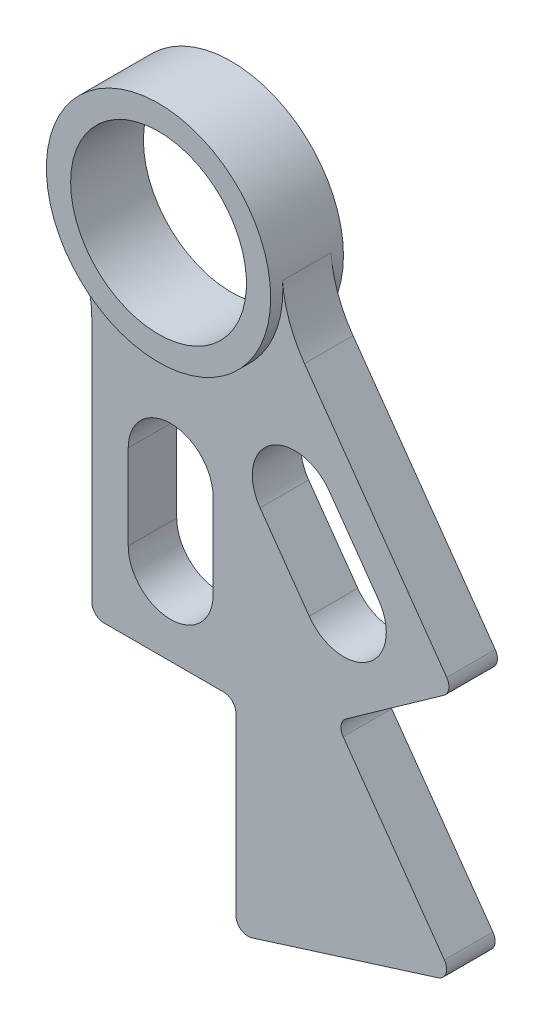
ISO-10303-21;
HEADER;
FILE_DESCRIPTION(('STEP AP214'),'2;1');
FILE_NAME('part.step','',(''),(''),'','','');
FILE_SCHEMA(('AUTOMOTIVE_DESIGN { 1 0 10303 214 1 1 1 1 }'));
ENDSEC;
DATA;
#1=APPLICATION_CONTEXT('core data for automotive mechanical design processes');
#2=APPLICATION_PROTOCOL_DEFINITION('international standard','automotive_design',2000,#1);
#3=PRODUCT_CONTEXT('',#1,'mechanical');
#4=PRODUCT('Part','Part','',(#3));
#5=PRODUCT_RELATED_PRODUCT_CATEGORY('part','',(#4));
#6=PRODUCT_DEFINITION_FORMATION('','',#4);
#7=PRODUCT_DEFINITION_CONTEXT('part definition',#1,'design');
#8=PRODUCT_DEFINITION('design','',#6,#7);
#9=PRODUCT_DEFINITION_SHAPE('','',#8);
#10=(LENGTH_UNIT() NAMED_UNIT(*) SI_UNIT(.MILLI.,.METRE.));
#11=(NAMED_UNIT(*) PLANE_ANGLE_UNIT() SI_UNIT($,.RADIAN.));
#12=(NAMED_UNIT(*) SI_UNIT($,.STERADIAN.) SOLID_ANGLE_UNIT());
#13=UNCERTAINTY_MEASURE_WITH_UNIT(LENGTH_MEASURE(1.E-05),#10,'distance_accuracy_value','');
#14=(GEOMETRIC_REPRESENTATION_CONTEXT(3) GLOBAL_UNCERTAINTY_ASSIGNED_CONTEXT((#13)) GLOBAL_UNIT_ASSIGNED_CONTEXT((#10,
#11,#12)) REPRESENTATION_CONTEXT('',''));
#15=CARTESIAN_POINT('',(0.,0.,0.));
#16=DIRECTION('',(0.,0.,1.));
#17=DIRECTION('',(1.,0.,0.));
#18=AXIS2_PLACEMENT_3D('',#15,#16,#17);
#19=CARTESIAN_POINT('',(0.,0.,4.7625));
#20=DIRECTION('',(0.,0.,-1.));
#21=DIRECTION('',(-1.,0.,0.));
#22=AXIS2_PLACEMENT_3D('',#19,#20,#21);
#23=CYLINDRICAL_SURFACE('',#22,11.5062);
#24=CARTESIAN_POINT('',(0.,0.,4.7625));
#25=DIRECTION('',(0.,0.,1.));
#26=DIRECTION('',(1.,0.,0.));
#27=AXIS2_PLACEMENT_3D('',#24,#25,#26);
#28=CIRCLE('',#27,11.5062);
#29=CARTESIAN_POINT('',(-11.5062,0.,4.7625));
#30=VERTEX_POINT('',#29);
#31=EDGE_CURVE('E396',#30,#30,#28,.T.);
#32=CARTESIAN_POINT('',(0.,0.,-4.7625));
#33=DIRECTION('',(0.,0.,1.));
#34=DIRECTION('',(1.,0.,0.));
#35=AXIS2_PLACEMENT_3D('',#32,#33,#34);
#36=CIRCLE('',#35,11.5062);
#37=CARTESIAN_POINT('',(-11.5062,0.,-4.7625));
#38=VERTEX_POINT('',#37);
#39=EDGE_CURVE('E377',#38,#38,#36,.T.);
#40=CARTESIAN_POINT('',(-11.5062,0.,4.7625));
#41=CARTESIAN_POINT('',(-11.5062,0.,4.66328125));
#42=CARTESIAN_POINT('',(-11.5062,0.,4.5640625));
#43=CARTESIAN_POINT('',(-11.5062,0.,4.365625));
#44=CARTESIAN_POINT('',(-11.5062,0.,4.26640625));
#45=CARTESIAN_POINT('',(-11.5062,0.,4.06796875));
#46=CARTESIAN_POINT('',(-11.5062,0.,3.96875));
#47=CARTESIAN_POINT('',(-11.5062,0.,3.7703125));
#48=CARTESIAN_POINT('',(-11.5062,0.,3.67109375));
#49=CARTESIAN_POINT('',(-11.5062,0.,3.47265625));
#50=CARTESIAN_POINT('',(-11.5062,0.,3.3734375));
#51=CARTESIAN_POINT('',(-11.5062,0.,3.175));
#52=CARTESIAN_POINT('',(-11.5062,0.,3.07578125));
#53=CARTESIAN_POINT('',(-11.5062,0.,2.87734375));
#54=CARTESIAN_POINT('',(-11.5062,0.,2.778125));
#55=CARTESIAN_POINT('',(-11.5062,0.,2.5796875));
#56=CARTESIAN_POINT('',(-11.5062,0.,2.48046875));
#57=CARTESIAN_POINT('',(-11.5062,0.,2.28203125));
#58=CARTESIAN_POINT('',(-11.5062,0.,2.1828125));
#59=CARTESIAN_POINT('',(-11.5062,0.,1.984375));
#60=CARTESIAN_POINT('',(-11.5062,0.,1.88515625));
#61=CARTESIAN_POINT('',(-11.5062,0.,1.68671875));
#62=CARTESIAN_POINT('',(-11.5062,0.,1.5875));
#63=CARTESIAN_POINT('',(-11.5062,0.,1.3890625));
#64=CARTESIAN_POINT('',(-11.5062,0.,1.28984375));
#65=CARTESIAN_POINT('',(-11.5062,0.,1.09140625));
#66=CARTESIAN_POINT('',(-11.5062,0.,0.992187499999999));
#67=CARTESIAN_POINT('',(-11.5062,0.,0.79375));
#68=CARTESIAN_POINT('',(-11.5062,0.,0.69453125));
#69=CARTESIAN_POINT('',(-11.5062,0.,0.49609375));
#70=CARTESIAN_POINT('',(-11.5062,0.,0.396875));
#71=CARTESIAN_POINT('',(-11.5062,0.,0.1984375));
#72=CARTESIAN_POINT('',(-11.5062,0.,0.0992187500000001));
#73=CARTESIAN_POINT('',(-11.5062,0.,-0.0992187500000001));
#74=CARTESIAN_POINT('',(-11.5062,0.,-0.1984375));
#75=CARTESIAN_POINT('',(-11.5062,0.,-0.396875));
#76=CARTESIAN_POINT('',(-11.5062,0.,-0.49609375));
#77=CARTESIAN_POINT('',(-11.5062,0.,-0.69453125));
#78=CARTESIAN_POINT('',(-11.5062,0.,-0.793750000000001));
#79=CARTESIAN_POINT('',(-11.5062,0.,-0.992187500000001));
#80=CARTESIAN_POINT('',(-11.5062,0.,-1.09140625));
#81=CARTESIAN_POINT('',(-11.5062,0.,-1.28984375));
#82=CARTESIAN_POINT('',(-11.5062,0.,-1.3890625));
#83=CARTESIAN_POINT('',(-11.5062,0.,-1.5875));
#84=CARTESIAN_POINT('',(-11.5062,0.,-1.68671875));
#85=CARTESIAN_POINT('',(-11.5062,0.,-1.88515625));
#86=CARTESIAN_POINT('',(-11.5062,0.,-1.984375));
#87=CARTESIAN_POINT('',(-11.5062,0.,-2.1828125));
#88=CARTESIAN_POINT('',(-11.5062,0.,-2.28203125));
#89=CARTESIAN_POINT('',(-11.5062,0.,-2.48046875));
#90=CARTESIAN_POINT('',(-11.5062,0.,-2.5796875));
#91=CARTESIAN_POINT('',(-11.5062,0.,-2.778125));
#92=CARTESIAN_POINT('',(-11.5062,0.,-2.87734375));
#93=CARTESIAN_POINT('',(-11.5062,0.,-3.07578125));
#94=CARTESIAN_POINT('',(-11.5062,0.,-3.175));
#95=CARTESIAN_POINT('',(-11.5062,0.,-3.3734375));
#96=CARTESIAN_POINT('',(-11.5062,0.,-3.47265625));
#97=CARTESIAN_POINT('',(-11.5062,0.,-3.67109375));
#98=CARTESIAN_POINT('',(-11.5062,0.,-3.7703125));
#99=CARTESIAN_POINT('',(-11.5062,0.,-3.96875));
#100=CARTESIAN_POINT('',(-11.5062,0.,-4.06796875));
#101=CARTESIAN_POINT('',(-11.5062,0.,-4.26640625));
#102=CARTESIAN_POINT('',(-11.5062,0.,-4.365625));
#103=CARTESIAN_POINT('',(-11.5062,0.,-4.5640625));
#104=CARTESIAN_POINT('',(-11.5062,0.,-4.66328125));
#105=CARTESIAN_POINT('',(-11.5062,0.,-4.7625));
#106=B_SPLINE_CURVE_WITH_KNOTS('',3,(#40,#41,#42,#43,#44,#45,#46,#47,#48,#49,#50,#51,#52,#53,
#54,#55,#56,#57,#58,#59,#60,#61,#62,#63,#64,#65,#66,#67,#68,#69,#70,#71,#72,#73,#74,#75,#76,#77,
#78,#79,#80,#81,#82,#83,#84,#85,#86,#87,#88,#89,#90,#91,#92,#93,#94,#95,#96,#97,#98,#99,#100,
#101,#102,#103,#104,#105),.UNSPECIFIED.,.F.,.F.,(4,2,2,2,2,2,2,2,2,2,2,2,2,2,2,2,2,2,2,2,2,2,2,
2,2,2,2,2,2,2,2,2,4),(0.,0.29765625,0.5953125,0.892968750000001,1.190625,1.48828125,1.7859375,
2.08359375,2.38125,2.67890625,2.9765625,3.27421875,3.571875,3.86953125,4.1671875,4.46484375,
4.7625,5.06015625,5.3578125,5.65546875,5.953125,6.25078125,6.5484375,6.84609375,7.14375,
7.44140625,7.7390625,8.03671875,8.334375,8.63203125,8.9296875,9.22734375,9.525),.UNSPECIFIED.);
#107=EDGE_CURVE('BSEAM47',#30,#38,#106,.T.);
#108=ORIENTED_EDGE('',*,*,#31,.T.);
#109=ORIENTED_EDGE('',*,*,#39,.F.);
#110=ORIENTED_EDGE('',*,*,#107,.T.);
#111=ORIENTED_EDGE('',*,*,#107,.F.);
#112=EDGE_LOOP('',(#108,#110,#109,#111));
#113=FACE_BOUND('',#112,.T.);
#114=ADVANCED_FACE('F47',(#113),#23,.F.);
#115=CARTESIAN_POINT('',(0.,0.,4.7625));
#116=DIRECTION('',(0.,0.,-1.));
#117=DIRECTION('',(-1.,0.,0.));
#118=AXIS2_PLACEMENT_3D('',#115,#116,#117);
#119=CYLINDRICAL_SURFACE('',#118,14.6812);
#120=DIRECTION('',(0.,0.,-1.));
#121=VECTOR('',#120,1.);
#122=CARTESIAN_POINT('',(-12.585193266832,-7.55979787272687,3.175));
#123=LINE('',#122,#121);
#124=CARTESIAN_POINT('',(-12.585193266832,-7.55979787272688,3.175));
#125=VERTEX_POINT('',#124);
#126=CARTESIAN_POINT('',(-12.585193266832,-7.55979787272687,-3.175));
#127=VERTEX_POINT('',#126);
#128=EDGE_CURVE('E390',#125,#127,#123,.T.);
#129=ORIENTED_EDGE('',*,*,#128,.F.);
#130=CARTESIAN_POINT('',(0.,0.,3.175));
#131=DIRECTION('',(0.,0.,1.));
#132=DIRECTION('',(1.,0.,0.));
#133=AXIS2_PLACEMENT_3D('',#130,#131,#132);
#134=CIRCLE('',#133,14.6812);
#135=CARTESIAN_POINT('',(14.6391568085927,1.11027986266355,3.175));
#136=VERTEX_POINT('',#135);
#137=EDGE_CURVE('E240',#125,#136,#134,.T.);
#138=ORIENTED_EDGE('',*,*,#137,.T.);
#139=DIRECTION('',(0.,0.,-1.));
#140=VECTOR('',#139,1.);
#141=CARTESIAN_POINT('',(14.6391568085926,1.11027986266355,3.175));
#142=LINE('',#141,#140);
#143=CARTESIAN_POINT('',(14.6391568085926,1.11027986266355,-3.175));
#144=VERTEX_POINT('',#143);
#145=EDGE_CURVE('E236',#136,#144,#142,.T.);
#146=ORIENTED_EDGE('',*,*,#145,.T.);
#147=CARTESIAN_POINT('',(0.,0.,-3.175));
#148=DIRECTION('',(0.,0.,1.));
#149=DIRECTION('',(1.,0.,0.));
#150=AXIS2_PLACEMENT_3D('',#147,#148,#149);
#151=CIRCLE('',#150,14.6812);
#152=EDGE_CURVE('E308',#127,#144,#151,.T.);
#153=ORIENTED_EDGE('',*,*,#152,.F.);
#154=EDGE_LOOP('',(#129,#138,#146,#153));
#155=FACE_BOUND('',#154,.T.);
#156=CARTESIAN_POINT('',(0.,0.,4.7625));
#157=DIRECTION('',(0.,0.,1.));
#158=DIRECTION('',(1.,0.,0.));
#159=AXIS2_PLACEMENT_3D('',#156,#157,#158);
#160=CIRCLE('',#159,14.6812);
#161=CARTESIAN_POINT('',(14.6812,0.,4.7625));
#162=VERTEX_POINT('',#161);
#163=EDGE_CURVE('E400',#162,#162,#160,.T.);
#164=ORIENTED_EDGE('',*,*,#163,.F.);
#165=EDGE_LOOP('',(#164));
#166=FACE_BOUND('',#165,.T.);
#167=CARTESIAN_POINT('',(0.,0.,-4.7625));
#168=DIRECTION('',(0.,0.,1.));
#169=DIRECTION('',(1.,0.,0.));
#170=AXIS2_PLACEMENT_3D('',#167,#168,#169);
#171=CIRCLE('',#170,14.6812);
#172=CARTESIAN_POINT('',(14.6812,0.,-4.7625));
#173=VERTEX_POINT('',#172);
#174=EDGE_CURVE('E401',#173,#173,#171,.T.);
#175=ORIENTED_EDGE('',*,*,#174,.T.);
#176=EDGE_LOOP('',(#175));
#177=FACE_BOUND('',#176,.T.);
#178=ADVANCED_FACE('F530',(#155,#166,#177),#119,.T.);
#179=CARTESIAN_POINT('',(0.,0.,4.7625));
#180=DIRECTION('',(0.,0.,1.));
#181=DIRECTION('',(1.,0.,0.));
#182=AXIS2_PLACEMENT_3D('',#179,#180,#181);
#183=PLANE('',#182);
#184=ORIENTED_EDGE('',*,*,#31,.F.);
#185=EDGE_LOOP('',(#184));
#186=FACE_BOUND('',#185,.T.);
#187=ORIENTED_EDGE('',*,*,#163,.T.);
#188=EDGE_LOOP('',(#187));
#189=FACE_BOUND('',#188,.T.);
#190=ADVANCED_FACE('F555',(#186,#189),#183,.T.);
#191=CARTESIAN_POINT('',(0.,0.,-4.7625));
#192=DIRECTION('',(0.,0.,1.));
#193=DIRECTION('',(1.,0.,0.));
#194=AXIS2_PLACEMENT_3D('',#191,#192,#193);
#195=PLANE('',#194);
#196=ORIENTED_EDGE('',*,*,#39,.T.);
#197=EDGE_LOOP('',(#196));
#198=FACE_BOUND('',#197,.T.);
#199=ORIENTED_EDGE('',*,*,#174,.F.);
#200=EDGE_LOOP('',(#199));
#201=FACE_BOUND('',#200,.T.);
#202=ADVANCED_FACE('F764',(#198,#201),#195,.F.);
#203=CARTESIAN_POINT('',(0.,-27.9580697939256,3.175));
#204=DIRECTION('',(0.,0.,-1.));
#205=DIRECTION('',(-1.,0.,0.));
#206=AXIS2_PLACEMENT_3D('',#203,#204,#205);
#207=CYLINDRICAL_SURFACE('',#206,5.55624999999839);
#208=CARTESIAN_POINT('',(0.,-27.9580697939256,-3.175));
#209=DIRECTION('',(0.,0.,1.));
#210=DIRECTION('',(1.,0.,0.));
#211=AXIS2_PLACEMENT_3D('',#208,#209,#210);
#212=CIRCLE('',#211,5.55624999999839);
#213=CARTESIAN_POINT('',(5.55624999999839,-27.9580697939257,-3.175));
#214=VERTEX_POINT('',#213);
#215=CARTESIAN_POINT('',(-5.55624999999839,-27.9580697939257,-3.175));
#216=VERTEX_POINT('',#215);
#217=EDGE_CURVE('E347',#214,#216,#212,.T.);
#218=ORIENTED_EDGE('',*,*,#217,.F.);
#219=DIRECTION('',(0.,0.,-1.));
#220=VECTOR('',#219,1.);
#221=CARTESIAN_POINT('',(5.55624999999839,-27.9580697939257,3.175));
#222=LINE('',#221,#220);
#223=CARTESIAN_POINT('',(5.55624999999839,-27.9580697939257,3.175));
#224=VERTEX_POINT('',#223);
#225=EDGE_CURVE('E374',#224,#214,#222,.T.);
#226=ORIENTED_EDGE('',*,*,#225,.F.);
#227=CARTESIAN_POINT('',(0.,-27.9580697939256,3.175));
#228=DIRECTION('',(0.,0.,1.));
#229=DIRECTION('',(1.,0.,0.));
#230=AXIS2_PLACEMENT_3D('',#227,#228,#229);
#231=CIRCLE('',#230,5.55624999999839);
#232=CARTESIAN_POINT('',(-5.55624999999839,-27.9580697939257,3.175));
#233=VERTEX_POINT('',#232);
#234=EDGE_CURVE('E279',#224,#233,#231,.T.);
#235=ORIENTED_EDGE('',*,*,#234,.T.);
#236=DIRECTION('',(0.,0.,-1.));
#237=VECTOR('',#236,1.);
#238=CARTESIAN_POINT('',(-5.55624999999839,-27.9580697939257,3.175));
#239=LINE('',#238,#237);
#240=EDGE_CURVE('E364',#233,#216,#239,.T.);
#241=ORIENTED_EDGE('',*,*,#240,.T.);
#242=EDGE_LOOP('',(#218,#226,#235,#241));
#243=FACE_BOUND('',#242,.T.);
#244=ADVANCED_FACE('F754',(#243),#207,.F.);
#245=CARTESIAN_POINT('',(5.5562499999984,0.,3.175));
#246=DIRECTION('',(-1.,0.,0.));
#247=DIRECTION('',(0.,-1.,0.));
#248=AXIS2_PLACEMENT_3D('',#245,#246,#247);
#249=PLANE('',#248);
#250=DIRECTION('',(0.,1.,0.));
#251=VECTOR('',#250,1.);
#252=CARTESIAN_POINT('',(5.5562499999984,0.,-3.175));
#253=LINE('',#252,#251);
#254=CARTESIAN_POINT('',(5.55624999999839,-39.0705697939289,-3.175));
#255=VERTEX_POINT('',#254);
#256=EDGE_CURVE('E351',#255,#214,#253,.T.);
#257=ORIENTED_EDGE('',*,*,#256,.F.);
#258=DIRECTION('',(0.,0.,-1.));
#259=VECTOR('',#258,1.);
#260=CARTESIAN_POINT('',(5.55624999999839,-39.0705697939289,3.175));
#261=LINE('',#260,#259);
#262=CARTESIAN_POINT('',(5.55624999999839,-39.0705697939289,3.175));
#263=VERTEX_POINT('',#262);
#264=EDGE_CURVE('E371',#263,#255,#261,.T.);
#265=ORIENTED_EDGE('',*,*,#264,.F.);
#266=DIRECTION('',(0.,1.,0.));
#267=VECTOR('',#266,1.);
#268=CARTESIAN_POINT('',(5.5562499999984,0.,3.175));
#269=LINE('',#268,#267);
#270=EDGE_CURVE('E283',#263,#224,#269,.T.);
#271=ORIENTED_EDGE('',*,*,#270,.T.);
#272=ORIENTED_EDGE('',*,*,#225,.T.);
#273=EDGE_LOOP('',(#257,#265,#271,#272));
#274=FACE_BOUND('',#273,.T.);
#275=ADVANCED_FACE('F744',(#274),#249,.T.);
#276=CARTESIAN_POINT('',(0.,-39.0705697939289,3.175));
#277=DIRECTION('',(0.,0.,-1.));
#278=DIRECTION('',(-1.,0.,0.));
#279=AXIS2_PLACEMENT_3D('',#276,#277,#278);
#280=CYLINDRICAL_SURFACE('',#279,5.55624999999839);
#281=CARTESIAN_POINT('',(0.,-39.0705697939289,-3.175));
#282=DIRECTION('',(0.,0.,1.));
#283=DIRECTION('',(1.,0.,0.));
#284=AXIS2_PLACEMENT_3D('',#281,#282,#283);
#285=CIRCLE('',#284,5.55624999999839);
#286=CARTESIAN_POINT('',(-5.55624999999839,-39.0705697939289,-3.175));
#287=VERTEX_POINT('',#286);
#288=EDGE_CURVE('E355',#287,#255,#285,.T.);
#289=ORIENTED_EDGE('',*,*,#288,.F.);
#290=DIRECTION('',(0.,0.,-1.));
#291=VECTOR('',#290,1.);
#292=CARTESIAN_POINT('',(-5.55624999999839,-39.0705697939289,3.175));
#293=LINE('',#292,#291);
#294=CARTESIAN_POINT('',(-5.55624999999839,-39.0705697939289,3.175));
#295=VERTEX_POINT('',#294);
#296=EDGE_CURVE('E367',#295,#287,#293,.T.);
#297=ORIENTED_EDGE('',*,*,#296,.F.);
#298=CARTESIAN_POINT('',(0.,-39.0705697939289,3.175));
#299=DIRECTION('',(0.,0.,1.));
#300=DIRECTION('',(1.,0.,0.));
#301=AXIS2_PLACEMENT_3D('',#298,#299,#300);
#302=CIRCLE('',#301,5.55624999999839);
#303=EDGE_CURVE('E287',#295,#263,#302,.T.);
#304=ORIENTED_EDGE('',*,*,#303,.T.);
#305=ORIENTED_EDGE('',*,*,#264,.T.);
#306=EDGE_LOOP('',(#289,#297,#304,#305));
#307=FACE_BOUND('',#306,.T.);
#308=ADVANCED_FACE('F734',(#307),#280,.F.);
#309=CARTESIAN_POINT('',(16.2411710413148,-22.9127804627989,3.175));
#310=DIRECTION('',(0.,0.,-1.));
#311=DIRECTION('',(-1.,0.,0.));
#312=AXIS2_PLACEMENT_3D('',#309,#310,#311);
#313=CYLINDRICAL_SURFACE('',#312,5.55624999999837);
#314=CARTESIAN_POINT('',(16.2411710413148,-22.9127804627989,-3.175));
#315=DIRECTION('',(0.,0.,1.));
#316=DIRECTION('',(1.,0.,0.));
#317=AXIS2_PLACEMENT_3D('',#314,#315,#316);
#318=CIRCLE('',#317,5.55624999999837);
#319=CARTESIAN_POINT('',(20.774153774864,-19.6996851327742,-3.175));
#320=VERTEX_POINT('',#319);
#321=CARTESIAN_POINT('',(11.7081883077655,-26.1258757928235,-3.175));
#322=VERTEX_POINT('',#321);
#323=EDGE_CURVE('E331',#320,#322,#318,.T.);
#324=ORIENTED_EDGE('',*,*,#323,.F.);
#325=DIRECTION('',(0.,0.,-1.));
#326=VECTOR('',#325,1.);
#327=CARTESIAN_POINT('',(20.774153774864,-19.6996851327742,3.175));
#328=LINE('',#327,#326);
#329=CARTESIAN_POINT('',(20.774153774864,-19.6996851327742,3.175));
#330=VERTEX_POINT('',#329);
#331=EDGE_CURVE('E368',#330,#320,#328,.T.);
#332=ORIENTED_EDGE('',*,*,#331,.F.);
#333=CARTESIAN_POINT('',(16.2411710413148,-22.9127804627989,3.175));
#334=DIRECTION('',(0.,0.,1.));
#335=DIRECTION('',(1.,0.,0.));
#336=AXIS2_PLACEMENT_3D('',#333,#334,#335);
#337=CIRCLE('',#336,5.55624999999837);
#338=CARTESIAN_POINT('',(11.7081883077655,-26.1258757928235,3.175));
#339=VERTEX_POINT('',#338);
#340=EDGE_CURVE('E264',#330,#339,#337,.T.);
#341=ORIENTED_EDGE('',*,*,#340,.T.);
#342=DIRECTION('',(0.,0.,-1.));
#343=VECTOR('',#342,1.);
#344=CARTESIAN_POINT('',(11.7081883077655,-26.1258757928235,3.175));
#345=LINE('',#344,#343);
#346=EDGE_CURVE('E235',#339,#322,#345,.T.);
#347=ORIENTED_EDGE('',*,*,#346,.T.);
#348=EDGE_LOOP('',(#324,#332,#341,#347));
#349=FACE_BOUND('',#348,.T.);
#350=ADVANCED_FACE('F724',(#349),#313,.F.);
#351=CARTESIAN_POINT('',(4.53298273354924,3.21309533002468,3.175));
#352=DIRECTION('',(-0.815834912675017,-0.578284873795387,0.));
#353=DIRECTION('',(0.578284873795387,-0.815834912675018,0.));
#354=AXIS2_PLACEMENT_3D('',#351,#352,#353);
#355=PLANE('',#354);
#356=DIRECTION('',(-0.578284873795387,0.815834912675018,0.));
#357=VECTOR('',#356,1.);
#358=CARTESIAN_POINT('',(4.53298273354924,3.21309533002468,-3.175));
#359=LINE('',#358,#357);
#360=CARTESIAN_POINT('',(27.2003444349171,-28.7656505998779,-3.175));
#361=VERTEX_POINT('',#360);
#362=EDGE_CURVE('E335',#361,#320,#359,.T.);
#363=ORIENTED_EDGE('',*,*,#362,.F.);
#364=DIRECTION('',(0.,0.,-1.));
#365=VECTOR('',#364,1.);
#366=CARTESIAN_POINT('',(27.2003444349171,-28.7656505998779,3.175));
#367=LINE('',#366,#365);
#368=CARTESIAN_POINT('',(27.2003444349171,-28.7656505998779,3.175));
#369=VERTEX_POINT('',#368);
#370=EDGE_CURVE('E383',#369,#361,#367,.T.);
#371=ORIENTED_EDGE('',*,*,#370,.F.);
#372=DIRECTION('',(-0.578284873795387,0.815834912675018,0.));
#373=VECTOR('',#372,1.);
#374=CARTESIAN_POINT('',(4.53298273354924,3.21309533002468,3.175));
#375=LINE('',#374,#373);
#376=EDGE_CURVE('E268',#369,#330,#375,.T.);
#377=ORIENTED_EDGE('',*,*,#376,.T.);
#378=ORIENTED_EDGE('',*,*,#331,.T.);
#379=EDGE_LOOP('',(#363,#371,#377,#378));
#380=FACE_BOUND('',#379,.T.);
#381=ADVANCED_FACE('F714',(#380),#355,.T.);
#382=CARTESIAN_POINT('',(22.6673617013679,-31.9787459299026,3.175));
#383=DIRECTION('',(0.,0.,-1.));
#384=DIRECTION('',(-1.,0.,0.));
#385=AXIS2_PLACEMENT_3D('',#382,#383,#384);
#386=CYLINDRICAL_SURFACE('',#385,5.55624999999837);
#387=CARTESIAN_POINT('',(22.6673617013679,-31.9787459299026,-3.175));
#388=DIRECTION('',(0.,0.,1.));
#389=DIRECTION('',(1.,0.,0.));
#390=AXIS2_PLACEMENT_3D('',#387,#388,#389);
#391=CIRCLE('',#390,5.55624999999837);
#392=CARTESIAN_POINT('',(18.1343789678186,-35.1918412599272,-3.175));
#393=VERTEX_POINT('',#392);
#394=EDGE_CURVE('E339',#393,#361,#391,.T.);
#395=ORIENTED_EDGE('',*,*,#394,.F.);
#396=DIRECTION('',(0.,0.,-1.));
#397=VECTOR('',#396,1.);
#398=CARTESIAN_POINT('',(18.1343789678186,-35.1918412599272,3.175));
#399=LINE('',#398,#397);
#400=CARTESIAN_POINT('',(18.1343789678186,-35.1918412599272,3.175));
#401=VERTEX_POINT('',#400);
#402=EDGE_CURVE('E380',#401,#393,#399,.T.);
#403=ORIENTED_EDGE('',*,*,#402,.F.);
#404=CARTESIAN_POINT('',(22.6673617013679,-31.9787459299026,3.175));
#405=DIRECTION('',(0.,0.,1.));
#406=DIRECTION('',(1.,0.,0.));
#407=AXIS2_PLACEMENT_3D('',#404,#405,#406);
#408=CIRCLE('',#407,5.55624999999837);
#409=EDGE_CURVE('E272',#401,#369,#408,.T.);
#410=ORIENTED_EDGE('',*,*,#409,.T.);
#411=ORIENTED_EDGE('',*,*,#370,.T.);
#412=EDGE_LOOP('',(#395,#403,#410,#411));
#413=FACE_BOUND('',#412,.T.);
#414=ADVANCED_FACE('F680',(#413),#386,.F.);
#415=CARTESIAN_POINT('',(-6.96784203042782,-4.938986535867,3.175));
#416=DIRECTION('',(-0.815834912675017,-0.578284873795387,0.));
#417=DIRECTION('',(0.578284873795387,-0.815834912675018,0.));
#418=AXIS2_PLACEMENT_3D('',#415,#416,#417);
#419=PLANE('',#418);
#420=DIRECTION('',(-0.578284873795387,0.815834912675018,0.));
#421=VECTOR('',#420,1.);
#422=CARTESIAN_POINT('',(-6.96784203042782,-4.938986535867,-3.175));
#423=LINE('',#422,#421);
#424=CARTESIAN_POINT('',(35.828390380426,-65.3152165115493,-3.175));
#425=VERTEX_POINT('',#424);
#426=CARTESIAN_POINT('',(22.5847239495654,-46.6312668948052,-3.175));
#427=VERTEX_POINT('',#426);
#428=EDGE_CURVE('E295',#425,#427,#423,.T.);
#429=ORIENTED_EDGE('',*,*,#428,.T.);
#430=DIRECTION('',(0.,0.,-1.));
#431=VECTOR('',#430,1.);
#432=CARTESIAN_POINT('',(22.5847239495654,-46.6312668948052,3.175));
#433=LINE('',#432,#431);
#434=CARTESIAN_POINT('',(22.5847239495654,-46.6312668948052,3.175));
#435=VERTEX_POINT('',#434);
#436=EDGE_CURVE('E422',#427,#435,#433,.F.);
#437=ORIENTED_EDGE('',*,*,#436,.T.);
#438=DIRECTION('',(-0.578284873795387,0.815834912675018,0.));
#439=VECTOR('',#438,1.);
#440=CARTESIAN_POINT('',(-6.96784203042782,-4.938986535867,3.175));
#441=LINE('',#440,#439);
#442=CARTESIAN_POINT('',(35.828390380426,-65.3152165115493,3.175));
#443=VERTEX_POINT('',#442);
#444=EDGE_CURVE('E363',#443,#435,#441,.T.);
#445=ORIENTED_EDGE('',*,*,#444,.F.);
#446=DIRECTION('',(0.,0.,-1.));
#447=VECTOR('',#446,1.);
#448=CARTESIAN_POINT('',(35.828390380426,-65.3152165115493,3.175));
#449=LINE('',#448,#447);
#450=EDGE_CURVE('E418',#443,#425,#449,.T.);
#451=ORIENTED_EDGE('',*,*,#450,.T.);
#452=EDGE_LOOP('',(#429,#437,#445,#451));
#453=FACE_BOUND('',#452,.T.);
#454=ADVANCED_FACE('F511',(#453),#419,.F.);
#455=CARTESIAN_POINT('',(28.634538742843,-40.3971424350667,3.175));
#456=DIRECTION('',(-0.578284873795385,0.815834912675019,0.));
#457=DIRECTION('',(-0.815834912675019,-0.578284873795385,0.));
#458=AXIS2_PLACEMENT_3D('',#455,#456,#457);
#459=PLANE('',#458);
#460=DIRECTION('',(0.815834912675019,0.578284873795385,0.));
#461=VECTOR('',#460,1.);
#462=CARTESIAN_POINT('',(28.634538742843,-40.3971424350667,3.175));
#463=LINE('',#462,#461);
#464=CARTESIAN_POINT('',(22.9618346362868,-44.4181017337834,3.175));
#465=VERTEX_POINT('',#464);
#466=CARTESIAN_POINT('',(35.7577973241355,-35.3479926307416,3.175));
#467=VERTEX_POINT('',#466);
#468=EDGE_CURVE('E224',#465,#467,#463,.T.);
#469=ORIENTED_EDGE('',*,*,#468,.F.);
#470=DIRECTION('',(0.,0.,-1.));
#471=VECTOR('',#470,1.);
#472=CARTESIAN_POINT('',(22.9618346362868,-44.4181017337834,-3.175));
#473=LINE('',#472,#471);
#474=CARTESIAN_POINT('',(22.9618346362868,-44.4181017337834,-3.175));
#475=VERTEX_POINT('',#474);
#476=EDGE_CURVE('E414',#465,#475,#473,.T.);
#477=ORIENTED_EDGE('',*,*,#476,.T.);
#478=DIRECTION('',(0.815834912675019,0.578284873795385,0.));
#479=VECTOR('',#478,1.);
#480=CARTESIAN_POINT('',(28.634538742843,-40.3971424350667,-3.175));
#481=LINE('',#480,#479);
#482=CARTESIAN_POINT('',(35.7577973241355,-35.3479926307416,-3.175));
#483=VERTEX_POINT('',#482);
#484=EDGE_CURVE('E299',#475,#483,#481,.T.);
#485=ORIENTED_EDGE('',*,*,#484,.T.);
#486=DIRECTION('',(0.,0.,-1.));
#487=VECTOR('',#486,1.);
#488=CARTESIAN_POINT('',(35.7577973241355,-35.3479926307416,3.175));
#489=LINE('',#488,#487);
#490=EDGE_CURVE('E405',#483,#467,#489,.F.);
#491=ORIENTED_EDGE('',*,*,#490,.T.);
#492=EDGE_LOOP('',(#469,#477,#485,#491));
#493=FACE_BOUND('',#492,.T.);
#494=ADVANCED_FACE('F661',(#493),#459,.F.);
#495=CARTESIAN_POINT('',(8.41839650516409,5.96717704147524,3.175));
#496=DIRECTION('',(-0.815834912675019,-0.578284873795385,0.));
#497=DIRECTION('',(0.578284873795385,-0.815834912675019,0.));
#498=AXIS2_PLACEMENT_3D('',#495,#496,#497);
#499=PLANE('',#498);
#500=DIRECTION('',(-0.578284873795385,0.815834912675019,0.));
#501=VECTOR('',#500,1.);
#502=CARTESIAN_POINT('',(8.41839650516409,5.96717704147524,3.175));
#503=LINE('',#502,#501);
#504=CARTESIAN_POINT('',(36.1349080108569,-33.1348274697199,3.175));
#505=VERTEX_POINT('',#504);
#506=CARTESIAN_POINT('',(17.5173156414512,-6.86943037360373,3.175));
#507=VERTEX_POINT('',#506);
#508=EDGE_CURVE('E208',#505,#507,#503,.T.);
#509=ORIENTED_EDGE('',*,*,#508,.F.);
#510=DIRECTION('',(0.,0.,-1.));
#511=VECTOR('',#510,1.);
#512=CARTESIAN_POINT('',(36.1349080108569,-33.1348274697199,3.175));
#513=LINE('',#512,#511);
#514=CARTESIAN_POINT('',(36.1349080108569,-33.1348274697199,-3.175));
#515=VERTEX_POINT('',#514);
#516=EDGE_CURVE('E455',#505,#515,#513,.T.);
#517=ORIENTED_EDGE('',*,*,#516,.T.);
#518=DIRECTION('',(-0.578284873795385,0.815834912675019,0.));
#519=VECTOR('',#518,1.);
#520=CARTESIAN_POINT('',(8.41839650516409,5.96717704147524,-3.175));
#521=LINE('',#520,#519);
#522=CARTESIAN_POINT('',(17.5173156414512,-6.86943037360373,-3.175));
#523=VERTEX_POINT('',#522);
#524=EDGE_CURVE('E230',#515,#523,#521,.T.);
#525=ORIENTED_EDGE('',*,*,#524,.T.);
#526=DIRECTION('',(0.,0.,-1.));
#527=VECTOR('',#526,1.);
#528=CARTESIAN_POINT('',(17.5173156414512,-6.86943037360373,3.175));
#529=LINE('',#528,#527);
#530=EDGE_CURVE('E227',#507,#523,#529,.T.);
#531=ORIENTED_EDGE('',*,*,#530,.F.);
#532=EDGE_LOOP('',(#509,#517,#525,#531));
#533=FACE_BOUND('',#532,.T.);
#534=ADVANCED_FACE('F228',(#533),#499,.F.);
#535=CARTESIAN_POINT('',(30.4686948801661,2.3108419978965,3.175));
#536=DIRECTION('',(0.,0.,-1.));
#537=DIRECTION('',(-1.,0.,0.));
#538=AXIS2_PLACEMENT_3D('',#535,#536,#537);
#539=CYLINDRICAL_SURFACE('',#538,15.8749999999984);
#540=CARTESIAN_POINT('',(30.4686948801661,2.3108419978965,-3.175));
#541=DIRECTION('',(0.,0.,1.));
#542=DIRECTION('',(1.,0.,0.));
#543=AXIS2_PLACEMENT_3D('',#540,#541,#542);
#544=CIRCLE('',#543,15.8749999999984);
#545=EDGE_CURVE('E305',#523,#144,#544,.F.);
#546=ORIENTED_EDGE('',*,*,#545,.T.);
#547=ORIENTED_EDGE('',*,*,#145,.F.);
#548=CARTESIAN_POINT('',(30.4686948801661,2.3108419978965,3.175));
#549=DIRECTION('',(0.,0.,1.));
#550=DIRECTION('',(1.,0.,0.));
#551=AXIS2_PLACEMENT_3D('',#548,#549,#550);
#552=CIRCLE('',#551,15.8749999999984);
#553=EDGE_CURVE('E215',#507,#136,#552,.F.);
#554=ORIENTED_EDGE('',*,*,#553,.F.);
#555=ORIENTED_EDGE('',*,*,#530,.T.);
#556=EDGE_LOOP('',(#546,#547,#554,#555));
#557=FACE_BOUND('',#556,.T.);
#558=ADVANCED_FACE('F238',(#557),#539,.F.);
#559=CARTESIAN_POINT('',(-26.1937499999968,-15.7343197939273,3.175));
#560=DIRECTION('',(0.,0.,-1.));
#561=DIRECTION('',(-1.,0.,0.));
#562=AXIS2_PLACEMENT_3D('',#559,#560,#561);
#563=CYLINDRICAL_SURFACE('',#562,15.8749999999984);
#564=CARTESIAN_POINT('',(-26.1937499999968,-15.7343197939273,-3.175));
#565=DIRECTION('',(0.,0.,1.));
#566=DIRECTION('',(1.,0.,0.));
#567=AXIS2_PLACEMENT_3D('',#564,#565,#566);
#568=CIRCLE('',#567,15.8749999999984);
#569=CARTESIAN_POINT('',(-10.3187499999984,-15.7343197939273,-3.175));
#570=VERTEX_POINT('',#569);
#571=EDGE_CURVE('E312',#570,#127,#568,.T.);
#572=ORIENTED_EDGE('',*,*,#571,.F.);
#573=DIRECTION('',(0.,0.,-1.));
#574=VECTOR('',#573,1.);
#575=CARTESIAN_POINT('',(-10.3187499999984,-15.7343197939273,3.175));
#576=LINE('',#575,#574);
#577=CARTESIAN_POINT('',(-10.3187499999984,-15.7343197939273,3.175));
#578=VERTEX_POINT('',#577);
#579=EDGE_CURVE('E294',#578,#570,#576,.T.);
#580=ORIENTED_EDGE('',*,*,#579,.F.);
#581=CARTESIAN_POINT('',(-26.1937499999968,-15.7343197939273,3.175));
#582=DIRECTION('',(0.,0.,1.));
#583=DIRECTION('',(1.,0.,0.));
#584=AXIS2_PLACEMENT_3D('',#581,#582,#583);
#585=CIRCLE('',#584,15.8749999999984);
#586=EDGE_CURVE('E244',#578,#125,#585,.T.);
#587=ORIENTED_EDGE('',*,*,#586,.T.);
#588=ORIENTED_EDGE('',*,*,#128,.T.);
#589=EDGE_LOOP('',(#572,#580,#587,#588));
#590=FACE_BOUND('',#589,.T.);
#591=ADVANCED_FACE('F533',(#590),#563,.F.);
#592=CARTESIAN_POINT('',(-10.3187499999984,0.,3.175));
#593=DIRECTION('',(1.,0.,0.));
#594=DIRECTION('',(0.,1.,0.));
#595=AXIS2_PLACEMENT_3D('',#592,#593,#594);
#596=PLANE('',#595);
#597=DIRECTION('',(0.,-1.,0.));
#598=VECTOR('',#597,1.);
#599=CARTESIAN_POINT('',(-10.3187499999984,0.,-3.175));
#600=LINE('',#599,#598);
#601=CARTESIAN_POINT('',(-10.3187499999984,-47.8018197939273,-3.175));
#602=VERTEX_POINT('',#601);
#603=EDGE_CURVE('E316',#570,#602,#600,.T.);
#604=ORIENTED_EDGE('',*,*,#603,.T.);
#605=DIRECTION('',(0.,0.,-1.));
#606=VECTOR('',#605,1.);
#607=CARTESIAN_POINT('',(-10.3187499999984,-47.8018197939273,3.175));
#608=LINE('',#607,#606);
#609=CARTESIAN_POINT('',(-10.3187499999984,-47.8018197939273,3.175));
#610=VERTEX_POINT('',#609);
#611=EDGE_CURVE('E471',#602,#610,#608,.F.);
#612=ORIENTED_EDGE('',*,*,#611,.T.);
#613=DIRECTION('',(0.,-1.,0.));
#614=VECTOR('',#613,1.);
#615=CARTESIAN_POINT('',(-10.3187499999984,0.,3.175));
#616=LINE('',#615,#614);
#617=EDGE_CURVE('E251',#578,#610,#616,.T.);
#618=ORIENTED_EDGE('',*,*,#617,.F.);
#619=ORIENTED_EDGE('',*,*,#579,.T.);
#620=EDGE_LOOP('',(#604,#612,#618,#619));
#621=FACE_BOUND('',#620,.T.);
#622=ADVANCED_FACE('F540',(#621),#596,.F.);
#623=CARTESIAN_POINT('',(0.,-49.3893197939273,3.175));
#624=DIRECTION('',(0.,1.,0.));
#625=DIRECTION('',(-1.,0.,0.));
#626=AXIS2_PLACEMENT_3D('',#623,#624,#625);
#627=PLANE('',#626);
#628=DIRECTION('',(1.,0.,0.));
#629=VECTOR('',#628,1.);
#630=CARTESIAN_POINT('',(0.,-49.3893197939273,-3.175));
#631=LINE('',#630,#629);
#632=CARTESIAN_POINT('',(-8.73124999999839,-49.3893197939273,-3.175));
#633=VERTEX_POINT('',#632);
#634=CARTESIAN_POINT('',(6.95324999999839,-49.3893197939273,-3.175));
#635=VERTEX_POINT('',#634);
#636=EDGE_CURVE('E320',#633,#635,#631,.T.);
#637=ORIENTED_EDGE('',*,*,#636,.T.);
#638=DIRECTION('',(0.,0.,-1.));
#639=VECTOR('',#638,1.);
#640=CARTESIAN_POINT('',(6.95324999999839,-49.3893197939273,3.175));
#641=LINE('',#640,#639);
#642=CARTESIAN_POINT('',(6.95324999999839,-49.3893197939273,3.175));
#643=VERTEX_POINT('',#642);
#644=EDGE_CURVE('E468',#635,#643,#641,.F.);
#645=ORIENTED_EDGE('',*,*,#644,.T.);
#646=DIRECTION('',(1.,0.,0.));
#647=VECTOR('',#646,1.);
#648=CARTESIAN_POINT('',(0.,-49.3893197939273,3.175));
#649=LINE('',#648,#647);
#650=CARTESIAN_POINT('',(-8.73124999999839,-49.3893197939273,3.175));
#651=VERTEX_POINT('',#650);
#652=EDGE_CURVE('E255',#651,#643,#649,.T.);
#653=ORIENTED_EDGE('',*,*,#652,.F.);
#654=DIRECTION('',(0.,0.,-1.));
#655=VECTOR('',#654,1.);
#656=CARTESIAN_POINT('',(-8.73124999999839,-49.3893197939273,3.175));
#657=LINE('',#656,#655);
#658=EDGE_CURVE('E464',#651,#633,#657,.T.);
#659=ORIENTED_EDGE('',*,*,#658,.T.);
#660=EDGE_LOOP('',(#637,#645,#653,#659));
#661=FACE_BOUND('',#660,.T.);
#662=ADVANCED_FACE('F491',(#661),#627,.F.);
#663=CARTESIAN_POINT('',(8.54074999999838,0.,3.175));
#664=DIRECTION('',(1.,0.,0.));
#665=DIRECTION('',(0.,1.,0.));
#666=AXIS2_PLACEMENT_3D('',#663,#664,#665);
#667=PLANE('',#666);
#668=DIRECTION('',(0.,-1.,0.));
#669=VECTOR('',#668,1.);
#670=CARTESIAN_POINT('',(8.54074999999838,0.,-3.175));
#671=LINE('',#670,#669);
#672=CARTESIAN_POINT('',(8.54074999999839,-50.9768197939273,-3.175));
#673=VERTEX_POINT('',#672);
#674=CARTESIAN_POINT('',(8.5407499999984,-73.8968839644596,-3.175));
#675=VERTEX_POINT('',#674);
#676=EDGE_CURVE('E324',#673,#675,#671,.T.);
#677=ORIENTED_EDGE('',*,*,#676,.T.);
#678=DIRECTION('',(0.,0.,-1.));
#679=VECTOR('',#678,1.);
#680=CARTESIAN_POINT('',(8.5407499999984,-73.8968839644596,3.175));
#681=LINE('',#680,#679);
#682=CARTESIAN_POINT('',(8.5407499999984,-73.8968839644596,3.175));
#683=VERTEX_POINT('',#682);
#684=EDGE_CURVE('E63',#675,#683,#681,.F.);
#685=ORIENTED_EDGE('',*,*,#684,.T.);
#686=DIRECTION('',(0.,-1.,0.));
#687=VECTOR('',#686,1.);
#688=CARTESIAN_POINT('',(8.54074999999838,0.,3.175));
#689=LINE('',#688,#687);
#690=CARTESIAN_POINT('',(8.54074999999839,-50.9768197939273,3.175));
#691=VERTEX_POINT('',#690);
#692=EDGE_CURVE('E258',#691,#683,#689,.T.);
#693=ORIENTED_EDGE('',*,*,#692,.F.);
#694=DIRECTION('',(0.,0.,-1.));
#695=VECTOR('',#694,1.);
#696=CARTESIAN_POINT('',(8.54074999999839,-50.9768197939273,-3.175));
#697=LINE('',#696,#695);
#698=EDGE_CURVE('E458',#691,#673,#697,.T.);
#699=ORIENTED_EDGE('',*,*,#698,.T.);
#700=EDGE_LOOP('',(#677,#685,#693,#699));
#701=FACE_BOUND('',#700,.T.);
#702=ADVANCED_FACE('F495',(#701),#667,.F.);
#703=CARTESIAN_POINT('',(-4.53298273354923,-3.21309533002468,3.175));
#704=DIRECTION('',(-0.815834912675017,-0.578284873795388,0.));
#705=DIRECTION('',(0.578284873795388,-0.815834912675017,0.));
#706=AXIS2_PLACEMENT_3D('',#703,#704,#705);
#707=PLANE('',#706);
#708=DIRECTION('',(-0.578284873795388,0.815834912675017,0.));
#709=VECTOR('',#708,1.);
#710=CARTESIAN_POINT('',(-4.53298273354923,-3.21309533002468,-3.175));
#711=LINE('',#710,#709);
#712=EDGE_CURVE('E343',#393,#322,#711,.T.);
#713=ORIENTED_EDGE('',*,*,#712,.T.);
#714=ORIENTED_EDGE('',*,*,#346,.F.);
#715=DIRECTION('',(-0.578284873795388,0.815834912675017,0.));
#716=VECTOR('',#715,1.);
#717=CARTESIAN_POINT('',(-4.53298273354923,-3.21309533002468,3.175));
#718=LINE('',#717,#716);
#719=EDGE_CURVE('E276',#401,#339,#718,.T.);
#720=ORIENTED_EDGE('',*,*,#719,.F.);
#721=ORIENTED_EDGE('',*,*,#402,.T.);
#722=EDGE_LOOP('',(#713,#714,#720,#721));
#723=FACE_BOUND('',#722,.T.);
#724=ADVANCED_FACE('F631',(#723),#707,.F.);
#725=CARTESIAN_POINT('',(22.5069129432965,-71.6736759824732,3.175));
#726=DIRECTION('',(-0.299595204551019,0.954066409329054,0.));
#727=DIRECTION('',(-0.954066409329054,-0.299595204551019,0.));
#728=AXIS2_PLACEMENT_3D('',#725,#726,#727);
#729=PLANE('',#728);
#730=DIRECTION('',(0.954066409329054,0.299595204551019,0.));
#731=VECTOR('',#730,1.);
#732=CARTESIAN_POINT('',(22.5069129432965,-71.6736759824732,-3.175));
#733=LINE('',#732,#731);
#734=CARTESIAN_POINT('',(10.6038573872231,-75.4114643892695,-3.175));
#735=VERTEX_POINT('',#734);
#736=CARTESIAN_POINT('',(35.0088598437791,-67.7478241735093,-3.175));
#737=VERTEX_POINT('',#736);
#738=EDGE_CURVE('E327',#735,#737,#733,.T.);
#739=ORIENTED_EDGE('',*,*,#738,.T.);
#740=DIRECTION('',(0.,0.,-1.));
#741=VECTOR('',#740,1.);
#742=CARTESIAN_POINT('',(35.0088598437791,-67.7478241735093,3.175));
#743=LINE('',#742,#741);
#744=CARTESIAN_POINT('',(35.0088598437791,-67.7478241735093,3.175));
#745=VERTEX_POINT('',#744);
#746=EDGE_CURVE('E441',#737,#745,#743,.F.);
#747=ORIENTED_EDGE('',*,*,#746,.T.);
#748=DIRECTION('',(0.954066409329054,0.299595204551019,0.));
#749=VECTOR('',#748,1.);
#750=CARTESIAN_POINT('',(22.5069129432965,-71.6736759824732,3.175));
#751=LINE('',#750,#749);
#752=CARTESIAN_POINT('',(10.6038573872231,-75.4114643892695,3.175));
#753=VERTEX_POINT('',#752);
#754=EDGE_CURVE('E261',#753,#745,#751,.T.);
#755=ORIENTED_EDGE('',*,*,#754,.F.);
#756=DIRECTION('',(0.,0.,-1.));
#757=VECTOR('',#756,1.);
#758=CARTESIAN_POINT('',(10.6038573872231,-75.4114643892695,3.175));
#759=LINE('',#758,#757);
#760=EDGE_CURVE('E437',#753,#735,#759,.T.);
#761=ORIENTED_EDGE('',*,*,#760,.T.);
#762=EDGE_LOOP('',(#739,#747,#755,#761));
#763=FACE_BOUND('',#762,.T.);
#764=ADVANCED_FACE('F503',(#763),#729,.F.);
#765=CARTESIAN_POINT('',(-5.55624999999839,0.,3.175));
#766=DIRECTION('',(-1.,0.,0.));
#767=DIRECTION('',(0.,-1.,0.));
#768=AXIS2_PLACEMENT_3D('',#765,#766,#767);
#769=PLANE('',#768);
#770=DIRECTION('',(0.,1.,0.));
#771=VECTOR('',#770,1.);
#772=CARTESIAN_POINT('',(-5.55624999999839,0.,-3.175));
#773=LINE('',#772,#771);
#774=EDGE_CURVE('E359',#287,#216,#773,.T.);
#775=ORIENTED_EDGE('',*,*,#774,.T.);
#776=ORIENTED_EDGE('',*,*,#240,.F.);
#777=DIRECTION('',(0.,1.,0.));
#778=VECTOR('',#777,1.);
#779=CARTESIAN_POINT('',(-5.55624999999839,0.,3.175));
#780=LINE('',#779,#778);
#781=EDGE_CURVE('E291',#295,#233,#780,.T.);
#782=ORIENTED_EDGE('',*,*,#781,.F.);
#783=ORIENTED_EDGE('',*,*,#296,.T.);
#784=EDGE_LOOP('',(#775,#776,#782,#783));
#785=FACE_BOUND('',#784,.T.);
#786=ADVANCED_FACE('F620',(#785),#769,.F.);
#787=CARTESIAN_POINT('',(0.,0.,3.175));
#788=DIRECTION('',(0.,0.,1.));
#789=DIRECTION('',(1.,0.,0.));
#790=AXIS2_PLACEMENT_3D('',#787,#788,#789);
#791=PLANE('',#790);
#792=ORIENTED_EDGE('',*,*,#754,.T.);
#793=CARTESIAN_POINT('',(34.5332524565544,-66.2332437486995,3.175));
#794=DIRECTION('',(0.,0.,1.));
#795=DIRECTION('',(1.,0.,0.));
#796=AXIS2_PLACEMENT_3D('',#793,#794,#795);
#797=CIRCLE('',#796,1.5875);
#798=EDGE_CURVE('E452',#745,#443,#797,.T.);
#799=ORIENTED_EDGE('',*,*,#798,.T.);
#800=ORIENTED_EDGE('',*,*,#444,.T.);
#801=CARTESIAN_POINT('',(23.879861873437,-45.713239657655,3.175));
#802=DIRECTION('',(0.,0.,1.));
#803=DIRECTION('',(1.,0.,0.));
#804=AXIS2_PLACEMENT_3D('',#801,#802,#803);
#805=CIRCLE('',#804,1.5875);
#806=EDGE_CURVE('E477',#435,#465,#805,.F.);
#807=ORIENTED_EDGE('',*,*,#806,.T.);
#808=ORIENTED_EDGE('',*,*,#468,.T.);
#809=CARTESIAN_POINT('',(34.8397700869853,-34.05285470687,3.175));
#810=DIRECTION('',(0.,0.,1.));
#811=DIRECTION('',(1.,0.,0.));
#812=AXIS2_PLACEMENT_3D('',#809,#810,#811);
#813=CIRCLE('',#812,1.5875);
#814=EDGE_CURVE('E219',#467,#505,#813,.T.);
#815=ORIENTED_EDGE('',*,*,#814,.T.);
#816=ORIENTED_EDGE('',*,*,#508,.T.);
#817=ORIENTED_EDGE('',*,*,#553,.T.);
#818=ORIENTED_EDGE('',*,*,#137,.F.);
#819=ORIENTED_EDGE('',*,*,#586,.F.);
#820=ORIENTED_EDGE('',*,*,#617,.T.);
#821=CARTESIAN_POINT('',(-8.73124999999839,-47.8018197939273,3.175));
#822=DIRECTION('',(0.,0.,1.));
#823=DIRECTION('',(1.,0.,0.));
#824=AXIS2_PLACEMENT_3D('',#821,#822,#823);
#825=CIRCLE('',#824,1.5875);
#826=EDGE_CURVE('E444',#610,#651,#825,.T.);
#827=ORIENTED_EDGE('',*,*,#826,.T.);
#828=ORIENTED_EDGE('',*,*,#652,.T.);
#829=CARTESIAN_POINT('',(6.95324999999839,-50.9768197939273,3.175));
#830=DIRECTION('',(0.,0.,1.));
#831=DIRECTION('',(1.,0.,0.));
#832=AXIS2_PLACEMENT_3D('',#829,#830,#831);
#833=CIRCLE('',#832,1.5875);
#834=EDGE_CURVE('E11',#643,#691,#833,.F.);
#835=ORIENTED_EDGE('',*,*,#834,.T.);
#836=ORIENTED_EDGE('',*,*,#692,.T.);
#837=CARTESIAN_POINT('',(10.1282499999984,-73.8968839644596,3.175));
#838=DIRECTION('',(0.,0.,1.));
#839=DIRECTION('',(1.,0.,0.));
#840=AXIS2_PLACEMENT_3D('',#837,#838,#839);
#841=CIRCLE('',#840,1.5875);
#842=EDGE_CURVE('E447',#683,#753,#841,.T.);
#843=ORIENTED_EDGE('',*,*,#842,.T.);
#844=EDGE_LOOP('',(#792,#799,#800,#807,#808,#815,#816,#817,#818,#819,#820,#827,#828,#835,#836,#843));
#845=FACE_BOUND('',#844,.T.);
#846=ORIENTED_EDGE('',*,*,#340,.F.);
#847=ORIENTED_EDGE('',*,*,#376,.F.);
#848=ORIENTED_EDGE('',*,*,#409,.F.);
#849=ORIENTED_EDGE('',*,*,#719,.T.);
#850=EDGE_LOOP('',(#846,#847,#848,#849));
#851=FACE_BOUND('',#850,.T.);
#852=ORIENTED_EDGE('',*,*,#234,.F.);
#853=ORIENTED_EDGE('',*,*,#270,.F.);
#854=ORIENTED_EDGE('',*,*,#303,.F.);
#855=ORIENTED_EDGE('',*,*,#781,.T.);
#856=EDGE_LOOP('',(#852,#853,#854,#855));
#857=FACE_BOUND('',#856,.T.);
#858=ADVANCED_FACE('F211',(#845,#851,#857),#791,.T.);
#859=CARTESIAN_POINT('',(0.,0.,-3.175));
#860=DIRECTION('',(0.,0.,1.));
#861=DIRECTION('',(1.,0.,0.));
#862=AXIS2_PLACEMENT_3D('',#859,#860,#861);
#863=PLANE('',#862);
#864=ORIENTED_EDGE('',*,*,#428,.F.);
#865=CARTESIAN_POINT('',(34.5332524565544,-66.2332437486995,-3.175));
#866=DIRECTION('',(0.,0.,1.));
#867=DIRECTION('',(1.,0.,0.));
#868=AXIS2_PLACEMENT_3D('',#865,#866,#867);
#869=CIRCLE('',#868,1.5875);
#870=EDGE_CURVE('E434',#425,#737,#869,.F.);
#871=ORIENTED_EDGE('',*,*,#870,.T.);
#872=ORIENTED_EDGE('',*,*,#738,.F.);
#873=CARTESIAN_POINT('',(10.1282499999984,-73.8968839644596,-3.175));
#874=DIRECTION('',(0.,0.,1.));
#875=DIRECTION('',(1.,0.,0.));
#876=AXIS2_PLACEMENT_3D('',#873,#874,#875);
#877=CIRCLE('',#876,1.5875);
#878=EDGE_CURVE('E428',#735,#675,#877,.F.);
#879=ORIENTED_EDGE('',*,*,#878,.T.);
#880=ORIENTED_EDGE('',*,*,#676,.F.);
#881=CARTESIAN_POINT('',(6.95324999999839,-50.9768197939273,-3.175));
#882=DIRECTION('',(0.,0.,1.));
#883=DIRECTION('',(1.,0.,0.));
#884=AXIS2_PLACEMENT_3D('',#881,#882,#883);
#885=CIRCLE('',#884,1.5875);
#886=EDGE_CURVE('E56',#673,#635,#885,.T.);
#887=ORIENTED_EDGE('',*,*,#886,.T.);
#888=ORIENTED_EDGE('',*,*,#636,.F.);
#889=CARTESIAN_POINT('',(-8.73124999999839,-47.8018197939273,-3.175));
#890=DIRECTION('',(0.,0.,1.));
#891=DIRECTION('',(1.,0.,0.));
#892=AXIS2_PLACEMENT_3D('',#889,#890,#891);
#893=CIRCLE('',#892,1.5875);
#894=EDGE_CURVE('E425',#633,#602,#893,.F.);
#895=ORIENTED_EDGE('',*,*,#894,.T.);
#896=ORIENTED_EDGE('',*,*,#603,.F.);
#897=ORIENTED_EDGE('',*,*,#571,.T.);
#898=ORIENTED_EDGE('',*,*,#152,.T.);
#899=ORIENTED_EDGE('',*,*,#545,.F.);
#900=ORIENTED_EDGE('',*,*,#524,.F.);
#901=CARTESIAN_POINT('',(34.8397700869853,-34.05285470687,-3.175));
#902=DIRECTION('',(0.,0.,1.));
#903=DIRECTION('',(1.,0.,0.));
#904=AXIS2_PLACEMENT_3D('',#901,#902,#903);
#905=CIRCLE('',#904,1.5875);
#906=EDGE_CURVE('E431',#515,#483,#905,.F.);
#907=ORIENTED_EDGE('',*,*,#906,.T.);
#908=ORIENTED_EDGE('',*,*,#484,.F.);
#909=CARTESIAN_POINT('',(23.879861873437,-45.713239657655,-3.175));
#910=DIRECTION('',(0.,0.,1.));
#911=DIRECTION('',(1.,0.,0.));
#912=AXIS2_PLACEMENT_3D('',#909,#910,#911);
#913=CIRCLE('',#912,1.5875);
#914=EDGE_CURVE('E474',#475,#427,#913,.T.);
#915=ORIENTED_EDGE('',*,*,#914,.T.);
#916=EDGE_LOOP('',(#864,#871,#872,#879,#880,#887,#888,#895,#896,#897,#898,#899,#900,#907,#908,#915));
#917=FACE_BOUND('',#916,.T.);
#918=ORIENTED_EDGE('',*,*,#323,.T.);
#919=ORIENTED_EDGE('',*,*,#712,.F.);
#920=ORIENTED_EDGE('',*,*,#394,.T.);
#921=ORIENTED_EDGE('',*,*,#362,.T.);
#922=EDGE_LOOP('',(#918,#919,#920,#921));
#923=FACE_BOUND('',#922,.T.);
#924=ORIENTED_EDGE('',*,*,#217,.T.);
#925=ORIENTED_EDGE('',*,*,#774,.F.);
#926=ORIENTED_EDGE('',*,*,#288,.T.);
#927=ORIENTED_EDGE('',*,*,#256,.T.);
#928=EDGE_LOOP('',(#924,#925,#926,#927));
#929=FACE_BOUND('',#928,.T.);
#930=ADVANCED_FACE('F485',(#917,#923,#929),#863,.F.);
#931=CARTESIAN_POINT('',(23.879861873437,-45.713239657655,3.175));
#932=DIRECTION('',(0.,0.,1.));
#933=DIRECTION('',(1.,0.,0.));
#934=AXIS2_PLACEMENT_3D('',#931,#932,#933);
#935=CYLINDRICAL_SURFACE('',#934,1.5875);
#936=ORIENTED_EDGE('',*,*,#806,.F.);
#937=ORIENTED_EDGE('',*,*,#436,.F.);
#938=ORIENTED_EDGE('',*,*,#914,.F.);
#939=ORIENTED_EDGE('',*,*,#476,.F.);
#940=EDGE_LOOP('',(#936,#937,#938,#939));
#941=FACE_BOUND('',#940,.T.);
#942=ADVANCED_FACE('F560',(#941),#935,.F.);
#943=CARTESIAN_POINT('',(34.5332524565544,-66.2332437486995,3.175));
#944=DIRECTION('',(0.,0.,-1.));
#945=DIRECTION('',(-1.,0.,0.));
#946=AXIS2_PLACEMENT_3D('',#943,#944,#945);
#947=CYLINDRICAL_SURFACE('',#946,1.5875);
#948=ORIENTED_EDGE('',*,*,#798,.F.);
#949=ORIENTED_EDGE('',*,*,#746,.F.);
#950=ORIENTED_EDGE('',*,*,#870,.F.);
#951=ORIENTED_EDGE('',*,*,#450,.F.);
#952=EDGE_LOOP('',(#948,#949,#950,#951));
#953=FACE_BOUND('',#952,.T.);
#954=ADVANCED_FACE('F508',(#953),#947,.T.);
#955=CARTESIAN_POINT('',(34.8397700869853,-34.05285470687,3.175));
#956=DIRECTION('',(0.,0.,-1.));
#957=DIRECTION('',(-1.,0.,0.));
#958=AXIS2_PLACEMENT_3D('',#955,#956,#957);
#959=CYLINDRICAL_SURFACE('',#958,1.5875);
#960=ORIENTED_EDGE('',*,*,#814,.F.);
#961=ORIENTED_EDGE('',*,*,#490,.F.);
#962=ORIENTED_EDGE('',*,*,#906,.F.);
#963=ORIENTED_EDGE('',*,*,#516,.F.);
#964=EDGE_LOOP('',(#960,#961,#962,#963));
#965=FACE_BOUND('',#964,.T.);
#966=ADVANCED_FACE('F525',(#965),#959,.T.);
#967=CARTESIAN_POINT('',(10.1282499999984,-73.8968839644596,3.175));
#968=DIRECTION('',(0.,0.,-1.));
#969=DIRECTION('',(-1.,0.,0.));
#970=AXIS2_PLACEMENT_3D('',#967,#968,#969);
#971=CYLINDRICAL_SURFACE('',#970,1.5875);
#972=ORIENTED_EDGE('',*,*,#842,.F.);
#973=ORIENTED_EDGE('',*,*,#684,.F.);
#974=ORIENTED_EDGE('',*,*,#878,.F.);
#975=ORIENTED_EDGE('',*,*,#760,.F.);
#976=EDGE_LOOP('',(#972,#973,#974,#975));
#977=FACE_BOUND('',#976,.T.);
#978=ADVANCED_FACE('F500',(#977),#971,.T.);
#979=CARTESIAN_POINT('',(6.95324999999839,-50.9768197939273,3.175));
#980=DIRECTION('',(0.,0.,1.));
#981=DIRECTION('',(1.,0.,0.));
#982=AXIS2_PLACEMENT_3D('',#979,#980,#981);
#983=CYLINDRICAL_SURFACE('',#982,1.5875);
#984=ORIENTED_EDGE('',*,*,#834,.F.);
#985=ORIENTED_EDGE('',*,*,#644,.F.);
#986=ORIENTED_EDGE('',*,*,#886,.F.);
#987=ORIENTED_EDGE('',*,*,#698,.F.);
#988=EDGE_LOOP('',(#984,#985,#986,#987));
#989=FACE_BOUND('',#988,.T.);
#990=ADVANCED_FACE('F494',(#989),#983,.F.);
#991=CARTESIAN_POINT('',(-8.73124999999839,-47.8018197939273,3.175));
#992=DIRECTION('',(0.,0.,-1.));
#993=DIRECTION('',(-1.,0.,0.));
#994=AXIS2_PLACEMENT_3D('',#991,#992,#993);
#995=CYLINDRICAL_SURFACE('',#994,1.5875);
#996=ORIENTED_EDGE('',*,*,#826,.F.);
#997=ORIENTED_EDGE('',*,*,#611,.F.);
#998=ORIENTED_EDGE('',*,*,#894,.F.);
#999=ORIENTED_EDGE('',*,*,#658,.F.);
#1000=EDGE_LOOP('',(#996,#997,#998,#999));
#1001=FACE_BOUND('',#1000,.T.);
#1002=ADVANCED_FACE('F49',(#1001),#995,.T.);
#1003=CLOSED_SHELL('',(#114,#178,#190,#202,#244,#275,#308,#350,#381,#414,#454,#494,#534,#558,
#591,#622,#662,#702,#724,#764,#786,#858,#930,#942,#954,#966,#978,#990,#1002));
#1004=MANIFOLD_SOLID_BREP('B2',#1003);
#1005=ADVANCED_BREP_SHAPE_REPRESENTATION('',(#18,#1004),#14);
#1006=SHAPE_DEFINITION_REPRESENTATION(#9,#1005);
ENDSEC;
END-ISO-10303-21;
